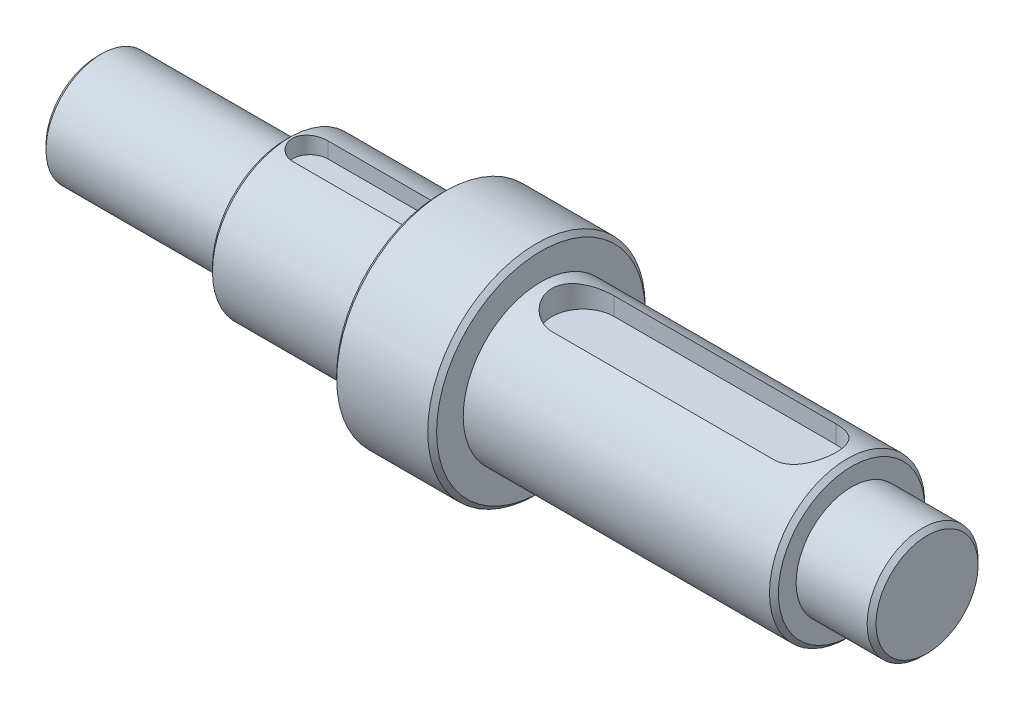
ISO-10303-21;
HEADER;
FILE_DESCRIPTION(('STEP AP214'),'2;1');
FILE_NAME('part.step','',(''),(''),'','','');
FILE_SCHEMA(('AUTOMOTIVE_DESIGN { 1 0 10303 214 1 1 1 1 }'));
ENDSEC;
DATA;
#1=APPLICATION_CONTEXT('core data for automotive mechanical design processes');
#2=APPLICATION_PROTOCOL_DEFINITION('international standard','automotive_design',2000,#1);
#3=PRODUCT_CONTEXT('',#1,'mechanical');
#4=PRODUCT('Part','Part','',(#3));
#5=PRODUCT_RELATED_PRODUCT_CATEGORY('part','',(#4));
#6=PRODUCT_DEFINITION_FORMATION('','',#4);
#7=PRODUCT_DEFINITION_CONTEXT('part definition',#1,'design');
#8=PRODUCT_DEFINITION('design','',#6,#7);
#9=PRODUCT_DEFINITION_SHAPE('','',#8);
#10=(LENGTH_UNIT() NAMED_UNIT(*) SI_UNIT(.MILLI.,.METRE.));
#11=(NAMED_UNIT(*) PLANE_ANGLE_UNIT() SI_UNIT($,.RADIAN.));
#12=(NAMED_UNIT(*) SI_UNIT($,.STERADIAN.) SOLID_ANGLE_UNIT());
#13=UNCERTAINTY_MEASURE_WITH_UNIT(LENGTH_MEASURE(1.E-05),#10,'distance_accuracy_value','');
#14=(GEOMETRIC_REPRESENTATION_CONTEXT(3) GLOBAL_UNCERTAINTY_ASSIGNED_CONTEXT((#13)) GLOBAL_UNIT_ASSIGNED_CONTEXT((#10,
#11,#12)) REPRESENTATION_CONTEXT('',''));
#15=CARTESIAN_POINT('',(0.,0.,0.));
#16=DIRECTION('',(0.,0.,1.));
#17=DIRECTION('',(1.,0.,0.));
#18=AXIS2_PLACEMENT_3D('',#15,#16,#17);
#19=CARTESIAN_POINT('',(-68.9095127610209,0.,0.));
#20=DIRECTION('',(1.,0.,0.));
#21=DIRECTION('',(0.,0.,-1.));
#22=AXIS2_PLACEMENT_3D('',#19,#20,#21);
#23=PLANE('',#22);
#24=CARTESIAN_POINT('',(-68.9095127610209,0.,0.));
#25=DIRECTION('',(-1.,0.,0.));
#26=DIRECTION('',(0.,0.,1.));
#27=AXIS2_PLACEMENT_3D('',#24,#25,#26);
#28=CIRCLE('',#27,11.5);
#29=CARTESIAN_POINT('',(-68.9095127610209,0.,11.5));
#30=VERTEX_POINT('',#29);
#31=EDGE_CURVE('E196',#30,#30,#28,.T.);
#32=ORIENTED_EDGE('',*,*,#31,.T.);
#33=EDGE_LOOP('',(#32));
#34=FACE_BOUND('',#33,.T.);
#35=ADVANCED_FACE('F33',(#34),#23,.F.);
#36=CARTESIAN_POINT('',(-67.9095127610209,0.,0.));
#37=DIRECTION('',(1.,0.,0.));
#38=DIRECTION('',(0.,0.,-1.));
#39=AXIS2_PLACEMENT_3D('',#36,#37,#38);
#40=CONICAL_SURFACE('',#39,12.5,0.785398163397448);
#41=ORIENTED_EDGE('',*,*,#31,.F.);
#42=EDGE_LOOP('',(#41));
#43=FACE_BOUND('',#42,.T.);
#44=CARTESIAN_POINT('',(-67.9095127610209,0.,0.));
#45=DIRECTION('',(-1.,0.,0.));
#46=DIRECTION('',(0.,0.,1.));
#47=AXIS2_PLACEMENT_3D('',#44,#45,#46);
#48=CIRCLE('',#47,12.5);
#49=CARTESIAN_POINT('',(-67.9095127610209,0.,12.5));
#50=VERTEX_POINT('',#49);
#51=EDGE_CURVE('E193',#50,#50,#48,.T.);
#52=ORIENTED_EDGE('',*,*,#51,.T.);
#53=EDGE_LOOP('',(#52));
#54=FACE_BOUND('',#53,.T.);
#55=ADVANCED_FACE('F285',(#43,#54),#40,.T.);
#56=CARTESIAN_POINT('',(-92.2273781902552,0.,0.));
#57=DIRECTION('',(-1.,0.,0.));
#58=DIRECTION('',(0.,0.,1.));
#59=AXIS2_PLACEMENT_3D('',#56,#57,#58);
#60=CYLINDRICAL_SURFACE('',#59,12.5);
#61=ORIENTED_EDGE('',*,*,#51,.F.);
#62=EDGE_LOOP('',(#61));
#63=FACE_BOUND('',#62,.T.);
#64=CARTESIAN_POINT('',(-26.4095127610209,0.,0.));
#65=DIRECTION('',(-1.,0.,0.));
#66=DIRECTION('',(0.,0.,1.));
#67=AXIS2_PLACEMENT_3D('',#64,#65,#66);
#68=CIRCLE('',#67,12.5);
#69=CARTESIAN_POINT('',(-26.4095127610209,0.,12.5));
#70=VERTEX_POINT('',#69);
#71=EDGE_CURVE('E190',#70,#70,#68,.T.);
#72=ORIENTED_EDGE('',*,*,#71,.T.);
#73=EDGE_LOOP('',(#72));
#74=FACE_BOUND('',#73,.T.);
#75=ADVANCED_FACE('F290',(#63,#74),#60,.T.);
#76=CARTESIAN_POINT('',(-26.4095127610209,12.5,0.));
#77=DIRECTION('',(1.,0.,0.));
#78=DIRECTION('',(0.,0.,-1.));
#79=AXIS2_PLACEMENT_3D('',#76,#77,#78);
#80=PLANE('',#79);
#81=ORIENTED_EDGE('',*,*,#71,.F.);
#82=EDGE_LOOP('',(#81));
#83=FACE_BOUND('',#82,.T.);
#84=CARTESIAN_POINT('',(-26.4095127610209,0.,0.));
#85=DIRECTION('',(-1.,0.,0.));
#86=DIRECTION('',(0.,0.,1.));
#87=AXIS2_PLACEMENT_3D('',#84,#85,#86);
#88=CIRCLE('',#87,16.5);
#89=CARTESIAN_POINT('',(-26.4095127610209,0.,16.5));
#90=VERTEX_POINT('',#89);
#91=EDGE_CURVE('E187',#90,#90,#88,.T.);
#92=ORIENTED_EDGE('',*,*,#91,.T.);
#93=EDGE_LOOP('',(#92));
#94=FACE_BOUND('',#93,.T.);
#95=ADVANCED_FACE('F298',(#83,#94),#80,.F.);
#96=CARTESIAN_POINT('',(-25.4095127610209,0.,0.));
#97=DIRECTION('',(1.,0.,0.));
#98=DIRECTION('',(0.,0.,-1.));
#99=AXIS2_PLACEMENT_3D('',#96,#97,#98);
#100=CONICAL_SURFACE('',#99,17.5,0.785398163397448);
#101=ORIENTED_EDGE('',*,*,#91,.F.);
#102=EDGE_LOOP('',(#101));
#103=FACE_BOUND('',#102,.T.);
#104=CARTESIAN_POINT('',(-25.4095127610209,0.,0.));
#105=DIRECTION('',(-1.,0.,0.));
#106=DIRECTION('',(0.,0.,1.));
#107=AXIS2_PLACEMENT_3D('',#104,#105,#106);
#108=CIRCLE('',#107,17.5);
#109=CARTESIAN_POINT('',(-25.4095127610209,0.,17.5));
#110=VERTEX_POINT('',#109);
#111=EDGE_CURVE('E184',#110,#110,#108,.T.);
#112=ORIENTED_EDGE('',*,*,#111,.T.);
#113=EDGE_LOOP('',(#112));
#114=FACE_BOUND('',#113,.T.);
#115=ADVANCED_FACE('F304',(#103,#114),#100,.T.);
#116=CARTESIAN_POINT('',(-92.2273781902552,0.,0.));
#117=DIRECTION('',(-1.,0.,0.));
#118=DIRECTION('',(0.,0.,1.));
#119=AXIS2_PLACEMENT_3D('',#116,#117,#118);
#120=CYLINDRICAL_SURFACE('',#119,17.5);
#121=DIRECTION('',(-1.,0.,0.));
#122=VECTOR('',#121,1.);
#123=CARTESIAN_POINT('',(-92.2273781902552,17.0367250374008,-4.));
#124=LINE('',#123,#122);
#125=CARTESIAN_POINT('',(-20.9095127610209,17.0367250374008,-4.));
#126=VERTEX_POINT('',#125);
#127=CARTESIAN_POINT('',(4.09048723897912,17.0367250374008,-4.));
#128=VERTEX_POINT('',#127);
#129=EDGE_CURVE('E449',#126,#128,#124,.F.);
#130=ORIENTED_EDGE('',*,*,#129,.T.);
#131=CARTESIAN_POINT('',(4.09048723897912,17.0367250374008,-4.));
#132=CARTESIAN_POINT('',(4.20141908799889,17.0367138660067,-4.00001248231752));
#133=CARTESIAN_POINT('',(4.31234376193843,17.0378082617858,-3.99538546502867));
#134=CARTESIAN_POINT('',(4.53336980621734,17.0421253952987,-3.97694932157873));
#135=CARTESIAN_POINT('',(4.64347129579083,17.0453478185126,-3.96314155232038));
#136=CARTESIAN_POINT('',(4.86188200385341,17.0538307536469,-3.92647318924765));
#137=CARTESIAN_POINT('',(4.97019404718199,17.059087651771,-3.90362864568808));
#138=CARTESIAN_POINT('',(5.18442812254881,17.0714746819689,-3.8490944107021));
#139=CARTESIAN_POINT('',(5.29035013236459,17.0786048314525,-3.81740463706964));
#140=CARTESIAN_POINT('',(5.60342224091412,17.1025105269156,-3.70940007909276));
#141=CARTESIAN_POINT('',(5.80607652477758,17.1218095761762,-3.6201165136919));
#142=CARTESIAN_POINT('',(6.19346842433704,17.1649441397841,-3.40971418070428));
#143=CARTESIAN_POINT('',(6.37820256297584,17.1887805318677,-3.28858925176468));
#144=CARTESIAN_POINT('',(6.72799335995641,17.2387926899631,-3.01555269417646));
#145=CARTESIAN_POINT('',(6.89267670461687,17.2650004661165,-2.8631677865296));
#146=CARTESIAN_POINT('',(7.19438675515377,17.3165247611238,-2.53295238865313));
#147=CARTESIAN_POINT('',(7.33140911024808,17.3418411392541,-2.35511790297881));
#148=CARTESIAN_POINT('',(7.57540755901788,17.3890809668325,-1.97651609742511));
#149=CARTESIAN_POINT('',(7.68201916164438,17.410961949179,-1.77550809318057));
#150=CARTESIAN_POINT('',(7.85980015675486,17.4484992744045,-1.35785483515843));
#151=CARTESIAN_POINT('',(7.93097573008189,17.4641567027157,-1.14121231594595));
#152=CARTESIAN_POINT('',(8.03468222489924,17.4872566687127,-0.702348968435727));
#153=CARTESIAN_POINT('',(8.06785115082917,17.4948346770719,-0.480286158684643));
#154=CARTESIAN_POINT('',(8.09659989733755,17.5013922359856,-0.0336222528298661));
#155=CARTESIAN_POINT('',(8.09218354586803,17.5003726621791,0.190978582456414));
#156=CARTESIAN_POINT('',(8.04635618896706,17.489952340558,0.631926010215037));
#157=CARTESIAN_POINT('',(8.00563403409762,17.4807076590668,0.848348430712727));
#158=CARTESIAN_POINT('',(7.88945127387399,17.4550549045918,1.27120201757733));
#159=CARTESIAN_POINT('',(7.81398929226324,17.4386465478123,1.4776327877559));
#160=CARTESIAN_POINT('',(7.62987695849114,17.4002626903077,1.87652973429281));
#161=CARTESIAN_POINT('',(7.52096987904288,17.3782443578209,2.06887311134545));
#162=CARTESIAN_POINT('',(7.27324422696532,17.3310474587669,2.43280009121924));
#163=CARTESIAN_POINT('',(7.13442204947528,17.3058685114888,2.60438118822771));
#164=CARTESIAN_POINT('',(6.82712910413045,17.2544419046369,2.92598580900956));
#165=CARTESIAN_POINT('',(6.658059501403,17.2281829516239,3.07543489417491));
#166=CARTESIAN_POINT('',(6.29682193596832,17.1780692090276,3.34405202485233));
#167=CARTESIAN_POINT('',(6.10464768133959,17.1542150775981,3.46321179425783));
#168=CARTESIAN_POINT('',(5.80286539782332,17.1222689727167,3.61671597326183));
#169=CARTESIAN_POINT('',(5.69973691447776,17.1122387789592,3.66376574815988));
#170=CARTESIAN_POINT('',(5.48974903880957,17.0937715302981,3.7489839926838));
#171=CARTESIAN_POINT('',(5.38289114055105,17.0853338458964,3.78715597297674));
#172=CARTESIAN_POINT('',(5.16631984756072,17.0703178704533,3.85427424858371));
#173=CARTESIAN_POINT('',(5.05660954038246,17.0637376534167,3.88323010403838));
#174=CARTESIAN_POINT('',(4.83506821183043,17.0526294698307,3.9317231468982));
#175=CARTESIAN_POINT('',(4.72323821646553,17.0481005355421,3.95126477595514));
#176=CARTESIAN_POINT('',(4.52449016412548,17.0420340571271,3.97733749089981));
#177=CARTESIAN_POINT('',(4.43783880166462,17.0400453891908,3.98583914323426));
#178=CARTESIAN_POINT('',(4.2642899419509,17.0373899876292,3.99716769798062));
#179=CARTESIAN_POINT('',(4.1773930889422,17.0367210727584,4.00000396405785));
#180=CARTESIAN_POINT('',(4.09048723897912,17.0367250374008,4.));
#181=B_SPLINE_CURVE_WITH_KNOTS('',3,(#131,#132,#133,#134,#135,#136,#137,#138,#139,#140,#141,
#142,#143,#144,#145,#146,#147,#148,#149,#150,#151,#152,#153,#154,#155,#156,#157,#158,#159,#160,
#161,#162,#163,#164,#165,#166,#167,#168,#169,#170,#171,#172,#173,#174,#175,#176,#177,#178,#179,
#180),.UNSPECIFIED.,.F.,.F.,(4,2,2,2,2,2,2,2,2,2,2,2,2,2,2,2,2,2,2,2,2,2,2,2,4),(0.,
0.332681247866697,0.665313336820848,0.997357270100382,1.32940428944207,1.99290262989595,
2.65652945292504,3.33106339250549,4.00570334664101,4.68811868485082,5.37041495269124,
6.0410817607265,6.71168026410032,7.36981967360707,8.02798515827642,8.69133469760162,
9.35476421731793,10.0331782060872,10.7117773626502,11.0528239514451,11.3937354453644,
11.7342921410368,12.0746880036043,12.3357711604052,12.5964224446493),.UNSPECIFIED.);
#182=CARTESIAN_POINT('',(4.09048723897912,17.0367250374008,4.));
#183=VERTEX_POINT('',#182);
#184=EDGE_CURVE('E199',#128,#183,#181,.T.);
#185=ORIENTED_EDGE('',*,*,#184,.T.);
#186=DIRECTION('',(-1.,0.,0.));
#187=VECTOR('',#186,1.);
#188=CARTESIAN_POINT('',(-92.2273781902552,17.0367250374008,4.));
#189=LINE('',#188,#187);
#190=CARTESIAN_POINT('',(-20.9095127610209,17.0367250374008,4.));
#191=VERTEX_POINT('',#190);
#192=EDGE_CURVE('E451',#183,#191,#189,.T.);
#193=ORIENTED_EDGE('',*,*,#192,.T.);
#194=CARTESIAN_POINT('',(-20.9095127610209,17.0367250374008,4.));
#195=CARTESIAN_POINT('',(-21.0204446100406,17.0367138660067,4.00001248231752));
#196=CARTESIAN_POINT('',(-21.1313692839802,17.0378082617858,3.99538546502867));
#197=CARTESIAN_POINT('',(-21.3523953282591,17.0421253952987,3.97694932157873));
#198=CARTESIAN_POINT('',(-21.4624968178326,17.0453478185126,3.96314155232038));
#199=CARTESIAN_POINT('',(-21.6809075258952,17.0538307536469,3.92647318924765));
#200=CARTESIAN_POINT('',(-21.7892195692238,17.059087651771,3.90362864568808));
#201=CARTESIAN_POINT('',(-22.0034536445906,17.0714746819689,3.8490944107021));
#202=CARTESIAN_POINT('',(-22.1093756544064,17.0786048314525,3.81740463706964));
#203=CARTESIAN_POINT('',(-22.4224477629559,17.1025105269156,3.70940007909276));
#204=CARTESIAN_POINT('',(-22.6251020468193,17.1218095761762,3.6201165136919));
#205=CARTESIAN_POINT('',(-23.0124939463788,17.1649441397841,3.40971418070428));
#206=CARTESIAN_POINT('',(-23.1972280850176,17.1887805318677,3.28858925176468));
#207=CARTESIAN_POINT('',(-23.5470188819982,17.2387926899631,3.01555269417646));
#208=CARTESIAN_POINT('',(-23.7117022266586,17.2650004661165,2.8631677865296));
#209=CARTESIAN_POINT('',(-24.0134122771955,17.3165247611238,2.53295238865314));
#210=CARTESIAN_POINT('',(-24.1504346322898,17.3418411392541,2.35511790297881));
#211=CARTESIAN_POINT('',(-24.3944330810596,17.3890809668325,1.97651609742511));
#212=CARTESIAN_POINT('',(-24.5010446836861,17.410961949179,1.77550809318057));
#213=CARTESIAN_POINT('',(-24.6788256787966,17.4484992744045,1.35785483515843));
#214=CARTESIAN_POINT('',(-24.7500012521237,17.4641567027157,1.14121231594595));
#215=CARTESIAN_POINT('',(-24.853707746941,17.4872566687127,0.702348968435727));
#216=CARTESIAN_POINT('',(-24.8868766728709,17.4948346770719,0.480286158684643));
#217=CARTESIAN_POINT('',(-24.9156254193793,17.5013922359856,0.033622252829867));
#218=CARTESIAN_POINT('',(-24.9112090679098,17.5003726621791,-0.190978582456414));
#219=CARTESIAN_POINT('',(-24.8653817110088,17.489952340558,-0.631926010215036));
#220=CARTESIAN_POINT('',(-24.8246595561394,17.4807076590668,-0.848348430712726));
#221=CARTESIAN_POINT('',(-24.7084767959158,17.4550549045918,-1.27120201757733));
#222=CARTESIAN_POINT('',(-24.633014814305,17.4386465478123,-1.4776327877559));
#223=CARTESIAN_POINT('',(-24.4489024805329,17.4002626903077,-1.87652973429281));
#224=CARTESIAN_POINT('',(-24.3399954010846,17.3782443578209,-2.06887311134545));
#225=CARTESIAN_POINT('',(-24.0922697490071,17.3310474587669,-2.43280009121923));
#226=CARTESIAN_POINT('',(-23.953447571517,17.3058685114888,-2.60438118822771));
#227=CARTESIAN_POINT('',(-23.6461546261722,17.2544419046369,-2.92598580900956));
#228=CARTESIAN_POINT('',(-23.4770850234448,17.2281829516239,-3.07543489417491));
#229=CARTESIAN_POINT('',(-23.1158474580101,17.1780692090276,-3.34405202485233));
#230=CARTESIAN_POINT('',(-22.9236732033814,17.1542150775981,-3.46321179425783));
#231=CARTESIAN_POINT('',(-22.6218909198651,17.1222689727167,-3.61671597326183));
#232=CARTESIAN_POINT('',(-22.5187624365195,17.1122387789592,-3.66376574815988));
#233=CARTESIAN_POINT('',(-22.3087745608513,17.0937715302981,-3.7489839926838));
#234=CARTESIAN_POINT('',(-22.2019166625928,17.0853338458964,-3.78715597297674));
#235=CARTESIAN_POINT('',(-21.9853453696025,17.0703178704533,-3.85427424858371));
#236=CARTESIAN_POINT('',(-21.8756350624242,17.0637376534167,-3.88323010403838));
#237=CARTESIAN_POINT('',(-21.6540937338722,17.0526294698307,-3.9317231468982));
#238=CARTESIAN_POINT('',(-21.5422637385073,17.0481005355421,-3.95126477595514));
#239=CARTESIAN_POINT('',(-21.3435156861672,17.0420340571271,-3.97733749089981));
#240=CARTESIAN_POINT('',(-21.2568643237064,17.0400453891908,-3.98583914323426));
#241=CARTESIAN_POINT('',(-21.0833154639927,17.0373899876292,-3.99716769798062));
#242=CARTESIAN_POINT('',(-20.996418610984,17.0367210727584,-4.00000396405785));
#243=CARTESIAN_POINT('',(-20.9095127610209,17.0367250374008,-4.));
#244=B_SPLINE_CURVE_WITH_KNOTS('',3,(#194,#195,#196,#197,#198,#199,#200,#201,#202,#203,#204,
#205,#206,#207,#208,#209,#210,#211,#212,#213,#214,#215,#216,#217,#218,#219,#220,#221,#222,#223,
#224,#225,#226,#227,#228,#229,#230,#231,#232,#233,#234,#235,#236,#237,#238,#239,#240,#241,#242,
#243),.UNSPECIFIED.,.F.,.F.,(4,2,2,2,2,2,2,2,2,2,2,2,2,2,2,2,2,2,2,2,2,2,2,2,4),(0.,
0.332681247866697,0.665313336820848,0.997357270100381,1.32940428944207,1.99290262989595,
2.65652945292504,3.33106339250548,4.00570334664101,4.68811868485082,5.37041495269124,
6.0410817607265,6.71168026410032,7.36981967360707,8.02798515827642,8.69133469760162,
9.35476421731793,10.0331782060872,10.7117773626502,11.0528239514451,11.3937354453644,
11.7342921410368,12.0746880036043,12.3357711604052,12.5964224446493),.UNSPECIFIED.);
#245=EDGE_CURVE('E55',#191,#126,#244,.T.);
#246=ORIENTED_EDGE('',*,*,#245,.T.);
#247=EDGE_LOOP('',(#130,#185,#193,#246));
#248=FACE_BOUND('',#247,.T.);
#249=ORIENTED_EDGE('',*,*,#111,.F.);
#250=EDGE_LOOP('',(#249));
#251=FACE_BOUND('',#250,.T.);
#252=CARTESIAN_POINT('',(8.59048723897912,0.,0.));
#253=DIRECTION('',(-1.,0.,0.));
#254=DIRECTION('',(0.,0.,1.));
#255=AXIS2_PLACEMENT_3D('',#252,#253,#254);
#256=CIRCLE('',#255,17.5);
#257=CARTESIAN_POINT('',(8.59048723897912,0.,17.5));
#258=VERTEX_POINT('',#257);
#259=EDGE_CURVE('E181',#258,#258,#256,.T.);
#260=ORIENTED_EDGE('',*,*,#259,.T.);
#261=EDGE_LOOP('',(#260));
#262=FACE_BOUND('',#261,.T.);
#263=ADVANCED_FACE('F214',(#248,#251,#262),#120,.T.);
#264=CARTESIAN_POINT('',(8.59048723897912,17.5,0.));
#265=DIRECTION('',(1.,0.,0.));
#266=DIRECTION('',(0.,0.,-1.));
#267=AXIS2_PLACEMENT_3D('',#264,#265,#266);
#268=PLANE('',#267);
#269=ORIENTED_EDGE('',*,*,#259,.F.);
#270=EDGE_LOOP('',(#269));
#271=FACE_BOUND('',#270,.T.);
#272=CARTESIAN_POINT('',(8.59048723897912,0.,0.));
#273=DIRECTION('',(-1.,0.,0.));
#274=DIRECTION('',(0.,0.,1.));
#275=AXIS2_PLACEMENT_3D('',#272,#273,#274);
#276=CIRCLE('',#275,23.5);
#277=CARTESIAN_POINT('',(8.59048723897912,0.,23.5));
#278=VERTEX_POINT('',#277);
#279=EDGE_CURVE('E178',#278,#278,#276,.T.);
#280=ORIENTED_EDGE('',*,*,#279,.T.);
#281=EDGE_LOOP('',(#280));
#282=FACE_BOUND('',#281,.T.);
#283=ADVANCED_FACE('F314',(#271,#282),#268,.F.);
#284=CARTESIAN_POINT('',(9.59048723897912,0.,0.));
#285=DIRECTION('',(1.,0.,0.));
#286=DIRECTION('',(0.,0.,-1.));
#287=AXIS2_PLACEMENT_3D('',#284,#285,#286);
#288=CONICAL_SURFACE('',#287,24.5,0.785398163397448);
#289=ORIENTED_EDGE('',*,*,#279,.F.);
#290=EDGE_LOOP('',(#289));
#291=FACE_BOUND('',#290,.T.);
#292=CARTESIAN_POINT('',(9.59048723897912,0.,0.));
#293=DIRECTION('',(-1.,0.,0.));
#294=DIRECTION('',(0.,0.,1.));
#295=AXIS2_PLACEMENT_3D('',#292,#293,#294);
#296=CIRCLE('',#295,24.5);
#297=CARTESIAN_POINT('',(9.59048723897912,0.,24.5));
#298=VERTEX_POINT('',#297);
#299=EDGE_CURVE('E175',#298,#298,#296,.T.);
#300=ORIENTED_EDGE('',*,*,#299,.T.);
#301=EDGE_LOOP('',(#300));
#302=FACE_BOUND('',#301,.T.);
#303=ADVANCED_FACE('F320',(#291,#302),#288,.T.);
#304=CARTESIAN_POINT('',(-92.2273781902552,0.,0.));
#305=DIRECTION('',(-1.,0.,0.));
#306=DIRECTION('',(0.,0.,1.));
#307=AXIS2_PLACEMENT_3D('',#304,#305,#306);
#308=CYLINDRICAL_SURFACE('',#307,24.5);
#309=ORIENTED_EDGE('',*,*,#299,.F.);
#310=EDGE_LOOP('',(#309));
#311=FACE_BOUND('',#310,.T.);
#312=CARTESIAN_POINT('',(30.0904872389791,0.,0.));
#313=DIRECTION('',(-1.,0.,0.));
#314=DIRECTION('',(0.,0.,1.));
#315=AXIS2_PLACEMENT_3D('',#312,#313,#314);
#316=CIRCLE('',#315,24.5);
#317=CARTESIAN_POINT('',(30.0904872389791,0.,24.5));
#318=VERTEX_POINT('',#317);
#319=EDGE_CURVE('E172',#318,#318,#316,.T.);
#320=ORIENTED_EDGE('',*,*,#319,.T.);
#321=EDGE_LOOP('',(#320));
#322=FACE_BOUND('',#321,.T.);
#323=ADVANCED_FACE('F325',(#311,#322),#308,.T.);
#324=CARTESIAN_POINT('',(31.0904872389791,0.,0.));
#325=DIRECTION('',(-1.,0.,0.));
#326=DIRECTION('',(0.,0.,1.));
#327=AXIS2_PLACEMENT_3D('',#324,#325,#326);
#328=CONICAL_SURFACE('',#327,23.5,0.785398163397448);
#329=ORIENTED_EDGE('',*,*,#319,.F.);
#330=EDGE_LOOP('',(#329));
#331=FACE_BOUND('',#330,.T.);
#332=CARTESIAN_POINT('',(31.0904872389791,0.,0.));
#333=DIRECTION('',(-1.,0.,0.));
#334=DIRECTION('',(0.,0.,1.));
#335=AXIS2_PLACEMENT_3D('',#332,#333,#334);
#336=CIRCLE('',#335,23.5);
#337=CARTESIAN_POINT('',(31.0904872389791,0.,23.5));
#338=VERTEX_POINT('',#337);
#339=EDGE_CURVE('E169',#338,#338,#336,.T.);
#340=ORIENTED_EDGE('',*,*,#339,.T.);
#341=EDGE_LOOP('',(#340));
#342=FACE_BOUND('',#341,.T.);
#343=ADVANCED_FACE('F331',(#331,#342),#328,.T.);
#344=CARTESIAN_POINT('',(31.0904872389791,23.5,0.));
#345=DIRECTION('',(-1.,0.,0.));
#346=DIRECTION('',(0.,0.,1.));
#347=AXIS2_PLACEMENT_3D('',#344,#345,#346);
#348=PLANE('',#347);
#349=ORIENTED_EDGE('',*,*,#339,.F.);
#350=EDGE_LOOP('',(#349));
#351=FACE_BOUND('',#350,.T.);
#352=CARTESIAN_POINT('',(31.0904872389791,0.,0.));
#353=DIRECTION('',(-1.,0.,0.));
#354=DIRECTION('',(0.,0.,1.));
#355=AXIS2_PLACEMENT_3D('',#352,#353,#354);
#356=CIRCLE('',#355,17.5);
#357=CARTESIAN_POINT('',(31.0904872389791,0.,17.5));
#358=VERTEX_POINT('',#357);
#359=EDGE_CURVE('E166',#358,#358,#356,.T.);
#360=ORIENTED_EDGE('',*,*,#359,.T.);
#361=EDGE_LOOP('',(#360));
#362=FACE_BOUND('',#361,.T.);
#363=ADVANCED_FACE('F258',(#351,#362),#348,.F.);
#364=CARTESIAN_POINT('',(-92.2273781902552,0.,0.));
#365=DIRECTION('',(-1.,0.,0.));
#366=DIRECTION('',(0.,0.,1.));
#367=AXIS2_PLACEMENT_3D('',#364,#365,#366);
#368=CYLINDRICAL_SURFACE('',#367,17.5);
#369=DIRECTION('',(-1.,0.,0.));
#370=VECTOR('',#369,1.);
#371=CARTESIAN_POINT('',(-92.2273781902552,16.0390149323454,-7.));
#372=LINE('',#371,#370);
#373=CARTESIAN_POINT('',(40.5904872389791,16.0390149323454,-7.));
#374=VERTEX_POINT('',#373);
#375=CARTESIAN_POINT('',(90.5904872389791,16.0390149323454,-7.));
#376=VERTEX_POINT('',#375);
#377=EDGE_CURVE('E11',#374,#376,#372,.F.);
#378=ORIENTED_EDGE('',*,*,#377,.T.);
#379=CARTESIAN_POINT('',(90.5904872389791,16.0390149323454,-7.));
#380=CARTESIAN_POINT('',(90.7788044456278,16.0389752733968,-7.00002977048744));
#381=CARTESIAN_POINT('',(90.9671054302353,16.0423302199083,-6.99240211723627));
#382=CARTESIAN_POINT('',(91.3421884205848,16.0555373781509,-6.96205578997394));
#383=CARTESIAN_POINT('',(91.528970977435,16.065387115302,-6.93934286357865));
#384=CARTESIAN_POINT('',(91.8989478525811,16.0912414264678,-6.87916795928254));
#385=CARTESIAN_POINT('',(92.0821533862435,16.1072216644699,-6.84176428487683));
#386=CARTESIAN_POINT('',(92.4444513375648,16.1448052762358,-6.75260066012111));
#387=CARTESIAN_POINT('',(92.62354350343,16.1664089932395,-6.70083983344195));
#388=CARTESIAN_POINT('',(92.9761959060988,16.2145342219444,-6.58353130438258));
#389=CARTESIAN_POINT('',(93.1497631751999,16.2410491630023,-6.51800200704895));
#390=CARTESIAN_POINT('',(93.4906372048829,16.2982398762079,-6.37364912170456));
#391=CARTESIAN_POINT('',(93.6579415908299,16.3289172065821,-6.2948205522932));
#392=CARTESIAN_POINT('',(93.9853810254402,16.3935818337901,-6.1244409615934));
#393=CARTESIAN_POINT('',(94.1455122681795,16.4275708580751,-6.03288328978561));
#394=CARTESIAN_POINT('',(94.4577359047685,16.4979533867701,-5.83766232543686));
#395=CARTESIAN_POINT('',(94.609825347452,16.5343477630188,-5.73399463295906));
#396=CARTESIAN_POINT('',(94.9127064101489,16.6105089133048,-5.50960400925462));
#397=CARTESIAN_POINT('',(95.063033458316,16.6503529603704,-5.3882798261924));
#398=CARTESIAN_POINT('',(95.3530744384824,16.7305950379342,-5.13371194040593));
#399=CARTESIAN_POINT('',(95.4927880676909,16.7709930841987,-5.00046789785534));
#400=CARTESIAN_POINT('',(95.7608578132901,16.8513017391641,-4.72276668795319));
#401=CARTESIAN_POINT('',(95.889209660331,16.8912121598178,-4.57830534349688));
#402=CARTESIAN_POINT('',(96.1336729502122,16.9694873597756,-4.27906605262243));
#403=CARTESIAN_POINT('',(96.249788608944,17.0078526686037,-4.12429168968039));
#404=CARTESIAN_POINT('',(96.4734500415148,17.0835515982152,-3.79885146321944));
#405=CARTESIAN_POINT('',(96.5804669778214,17.1207825079476,-3.62779752817488));
#406=CARTESIAN_POINT('',(96.7795848268386,17.1914591053842,-3.2765543948891));
#407=CARTESIAN_POINT('',(96.8716914010934,17.2249062283526,-3.09636869831209));
#408=CARTESIAN_POINT('',(97.0402044359055,17.2870679069983,-2.72803181638415));
#409=CARTESIAN_POINT('',(97.1166127900608,17.31578303339,-2.53988159506012));
#410=CARTESIAN_POINT('',(97.2529786200482,17.367636875606,-2.15696664795563));
#411=CARTESIAN_POINT('',(97.3129371480993,17.390775948093,-1.96220234614316));
#412=CARTESIAN_POINT('',(97.4132650915438,17.4298097688794,-1.57713403238594));
#413=CARTESIAN_POINT('',(97.4544420980453,17.4460009140269,-1.38707032109769));
#414=CARTESIAN_POINT('',(97.5208754698575,17.4722450511387,-1.00376608434129));
#415=CARTESIAN_POINT('',(97.5461327763272,17.4822984059628,-0.810525747365689));
#416=CARTESIAN_POINT('',(97.5804429866635,17.4959776408713,-0.422440108875656));
#417=CARTESIAN_POINT('',(97.589500498958,17.4996053488854,-0.227595279648425));
#418=CARTESIAN_POINT('',(97.5913211488956,17.5003335193545,0.162179533610087));
#419=CARTESIAN_POINT('',(97.5840848592335,17.4974342112213,0.357109514407691));
#420=CARTESIAN_POINT('',(97.5542704657181,17.4855399164815,0.734513118138501));
#421=CARTESIAN_POINT('',(97.5325811300752,17.4768981361587,0.917068936855519));
#422=CARTESIAN_POINT('',(97.4749799483455,17.4540980852493,1.27963381561551));
#423=CARTESIAN_POINT('',(97.4390634629031,17.4399380152185,1.45964202505281));
#424=CARTESIAN_POINT('',(97.3533658755707,17.4064635698492,1.81576582506985));
#425=CARTESIAN_POINT('',(97.3035895233871,17.3871509603546,1.99188272690389));
#426=CARTESIAN_POINT('',(97.1905929523159,17.3438367479227,2.33922484681341));
#427=CARTESIAN_POINT('',(97.1273676269891,17.319833364228,2.51044817875929));
#428=CARTESIAN_POINT('',(96.9869858374562,17.2673360941629,2.8493759943152));
#429=CARTESIAN_POINT('',(96.9096385238228,17.2387814708111,3.01699194659557));
#430=CARTESIAN_POINT('',(96.7422305443381,17.1781215258452,3.34514512562917));
#431=CARTESIAN_POINT('',(96.6521655546602,17.1460149974419,3.5056799204284));
#432=CARTESIAN_POINT('',(96.4599677046453,17.0790131236981,3.81876204706711));
#433=CARTESIAN_POINT('',(96.3578335509445,17.0441174795983,3.97130852032427));
#434=CARTESIAN_POINT('',(96.1421540849861,16.9723499864897,4.26761987662594));
#435=CARTESIAN_POINT('',(96.0286081717019,16.9354780334418,4.41138429650148));
#436=CARTESIAN_POINT('',(95.7829347551086,16.8581445983064,4.69856406049532));
#437=CARTESIAN_POINT('',(95.6500762207415,16.8176065589445,4.84133411766911));
#438=CARTESIAN_POINT('',(95.3729945728663,16.7363329993899,5.11522854799373));
#439=CARTESIAN_POINT('',(95.2287747841468,16.6955975402215,5.24635630446195));
#440=CARTESIAN_POINT('',(94.9296348737334,16.6149764927148,5.49634622388203));
#441=CARTESIAN_POINT('',(94.774706135124,16.5750916233731,5.61519831288958));
#442=CARTESIAN_POINT('',(94.4551833701638,16.4973294115574,5.83971185211883));
#443=CARTESIAN_POINT('',(94.2905931152817,16.4594512965686,5.94537839975713));
#444=CARTESIAN_POINT('',(93.9476686868559,16.3857200622421,6.14572280070553));
#445=CARTESIAN_POINT('',(93.7690731005583,16.3499588088217,6.23998790860957));
#446=CARTESIAN_POINT('',(93.4037891547123,16.2828884333371,6.41296751186905));
#447=CARTESIAN_POINT('',(93.2171043260204,16.2515773938496,6.49168871021356));
#448=CARTESIAN_POINT('',(92.8370890703008,16.1945049972359,6.63278222994985));
#449=CARTESIAN_POINT('',(92.6437672383632,16.168736754702,6.69517485625373));
#450=CARTESIAN_POINT('',(92.2518192969976,16.1236515550448,6.80303455331392));
#451=CARTESIAN_POINT('',(92.0531956086743,16.1043317058905,6.84850921263796));
#452=CARTESIAN_POINT('',(91.6449481091188,16.0723072315698,6.92334288535216));
#453=CARTESIAN_POINT('',(91.435185149166,16.0598644196122,6.95206612646659));
#454=CARTESIAN_POINT('',(91.1191322747683,16.0473784702879,6.98081208346758));
#455=CARTESIAN_POINT('',(91.0135639640917,16.0442462060019,6.98800424720682));
#456=CARTESIAN_POINT('',(90.8021655755459,16.0400632612632,6.99759856466878));
#457=CARTESIAN_POINT('',(90.6963354896668,16.039012645314,7.00000056995996));
#458=CARTESIAN_POINT('',(90.5904872389791,16.0390149323454,7.));
#459=B_SPLINE_CURVE_WITH_KNOTS('',3,(#379,#380,#381,#382,#383,#384,#385,#386,#387,#388,#389,
#390,#391,#392,#393,#394,#395,#396,#397,#398,#399,#400,#401,#402,#403,#404,#405,#406,#407,#408,
#409,#410,#411,#412,#413,#414,#415,#416,#417,#418,#419,#420,#421,#422,#423,#424,#425,#426,#427,
#428,#429,#430,#431,#432,#433,#434,#435,#436,#437,#438,#439,#440,#441,#442,#443,#444,#445,#446,
#447,#448,#449,#450,#451,#452,#453,#454,#455,#456,#457,#458),.UNSPECIFIED.,.F.,.F.,(4,2,2,2,2,2,
2,2,2,2,2,2,2,2,2,2,2,2,2,2,2,2,2,2,2,2,2,2,2,2,2,2,2,2,2,2,2,2,2,4),(0.,0.564741985882135,
1.12926892366124,1.6915776894512,2.25392078489309,2.8155168952135,3.37732382695849,
3.93942539439666,4.50173182929475,5.0928093500211,5.68390372730163,6.27521928204673,
6.86633043249007,7.48109453721441,8.09562466240333,8.71008061631073,9.32449725715898,
9.90917905170551,10.4938262771254,11.0783071588623,11.6627674975743,12.214247217053,
12.7659069177314,13.3173777995947,13.8690584443287,14.428836185522,14.9888047033781,
15.5488332834667,16.108891374228,16.7057974962847,17.3025295824187,17.8997475455416,
18.496733909321,19.11121416217,19.7254288516392,20.3388760838905,20.9520478211806,
21.5871885149797,21.9046550012937,22.2221313247158),.UNSPECIFIED.);
#460=CARTESIAN_POINT('',(90.5904872389791,16.0390149323454,7.));
#461=VERTEX_POINT('',#460);
#462=EDGE_CURVE('E263',#376,#461,#459,.T.);
#463=ORIENTED_EDGE('',*,*,#462,.T.);
#464=DIRECTION('',(-1.,0.,0.));
#465=VECTOR('',#464,1.);
#466=CARTESIAN_POINT('',(-92.2273781902552,16.0390149323454,7.));
#467=LINE('',#466,#465);
#468=CARTESIAN_POINT('',(40.5904872389791,16.0390149323454,7.));
#469=VERTEX_POINT('',#468);
#470=EDGE_CURVE('E40',#461,#469,#467,.T.);
#471=ORIENTED_EDGE('',*,*,#470,.T.);
#472=CARTESIAN_POINT('',(40.5904872389791,16.0390149323454,7.));
#473=CARTESIAN_POINT('',(40.4021700323304,16.0389752733968,7.00002977048744));
#474=CARTESIAN_POINT('',(40.2138690477229,16.0423302199083,6.99240211723627));
#475=CARTESIAN_POINT('',(39.8387860573734,16.0555373781509,6.96205578997394));
#476=CARTESIAN_POINT('',(39.6520035005233,16.065387115302,6.93934286357865));
#477=CARTESIAN_POINT('',(39.2820266253771,16.0912414264678,6.87916795928254));
#478=CARTESIAN_POINT('',(39.0988210917148,16.1072216644699,6.84176428487683));
#479=CARTESIAN_POINT('',(38.7365231403935,16.1448052762358,6.75260066012111));
#480=CARTESIAN_POINT('',(38.5574309745283,16.1664089932395,6.70083983344195));
#481=CARTESIAN_POINT('',(38.2047785718595,16.2145342219444,6.58353130438258));
#482=CARTESIAN_POINT('',(38.0312113027584,16.2410491630023,6.51800200704895));
#483=CARTESIAN_POINT('',(37.6903372730754,16.2982398762079,6.37364912170456));
#484=CARTESIAN_POINT('',(37.5230328871284,16.3289172065821,6.2948205522932));
#485=CARTESIAN_POINT('',(37.1955934525181,16.3935818337901,6.1244409615934));
#486=CARTESIAN_POINT('',(37.0354622097788,16.4275708580751,6.03288328978561));
#487=CARTESIAN_POINT('',(36.7232385731898,16.4979533867701,5.83766232543686));
#488=CARTESIAN_POINT('',(36.5711491305063,16.5343477630189,5.73399463295905));
#489=CARTESIAN_POINT('',(36.2682680678093,16.6105089133048,5.5096040092546));
#490=CARTESIAN_POINT('',(36.1179410196423,16.6503529603704,5.38827982619238));
#491=CARTESIAN_POINT('',(35.8279000394759,16.7305950379342,5.13371194040592));
#492=CARTESIAN_POINT('',(35.6881864102674,16.7709930841987,5.00046789785534));
#493=CARTESIAN_POINT('',(35.4201166646682,16.8513017391641,4.72276668795318));
#494=CARTESIAN_POINT('',(35.2917648176273,16.8912121598178,4.57830534349687));
#495=CARTESIAN_POINT('',(35.0473015277461,16.9694873597756,4.27906605262243));
#496=CARTESIAN_POINT('',(34.9311858690142,17.0078526686037,4.12429168968039));
#497=CARTESIAN_POINT('',(34.7075244364434,17.0835515982152,3.79885146321944));
#498=CARTESIAN_POINT('',(34.6005075001369,17.1207825079476,3.62779752817488));
#499=CARTESIAN_POINT('',(34.4013896511197,17.1914591053842,3.2765543948891));
#500=CARTESIAN_POINT('',(34.3092830768649,17.2249062283526,3.09636869831208));
#501=CARTESIAN_POINT('',(34.1407700420528,17.2870679069983,2.72803181638415));
#502=CARTESIAN_POINT('',(34.0643616878975,17.31578303339,2.53988159506011));
#503=CARTESIAN_POINT('',(33.9279958579101,17.367636875606,2.15696664795563));
#504=CARTESIAN_POINT('',(33.868037329859,17.390775948093,1.96220234614316));
#505=CARTESIAN_POINT('',(33.7677093864145,17.4298097688794,1.57713403238594));
#506=CARTESIAN_POINT('',(33.726532379913,17.4460009140269,1.38707032109769));
#507=CARTESIAN_POINT('',(33.6600990081007,17.4722450511387,1.00376608434129));
#508=CARTESIAN_POINT('',(33.6348417016311,17.4822984059628,0.810525747365688));
#509=CARTESIAN_POINT('',(33.6005314912948,17.4959776408713,0.422440108875656));
#510=CARTESIAN_POINT('',(33.5914739790003,17.4996053488854,0.227595279648426));
#511=CARTESIAN_POINT('',(33.5896533290627,17.5003335193545,-0.162179533610085));
#512=CARTESIAN_POINT('',(33.5968896187247,17.4974342112213,-0.357109514407689));
#513=CARTESIAN_POINT('',(33.6267040122402,17.4855399164815,-0.734513118138498));
#514=CARTESIAN_POINT('',(33.6483933478831,17.4768981361587,-0.917068936855516));
#515=CARTESIAN_POINT('',(33.7059945296128,17.4540980852493,-1.27963381561551));
#516=CARTESIAN_POINT('',(33.7419110150552,17.4399380152185,-1.4596420250528));
#517=CARTESIAN_POINT('',(33.8276086023876,17.4064635698492,-1.81576582506985));
#518=CARTESIAN_POINT('',(33.8773849545712,17.3871509603546,-1.99188272690389));
#519=CARTESIAN_POINT('',(33.9903815256424,17.3438367479227,-2.3392248468134));
#520=CARTESIAN_POINT('',(34.0536068509692,17.319833364228,-2.51044817875928));
#521=CARTESIAN_POINT('',(34.1939886405021,17.2673360941629,-2.8493759943152));
#522=CARTESIAN_POINT('',(34.2713359541355,17.2387814708111,-3.01699194659556));
#523=CARTESIAN_POINT('',(34.4387439336202,17.1781215258452,-3.34514512562916));
#524=CARTESIAN_POINT('',(34.5288089232981,17.1460149974419,-3.5056799204284));
#525=CARTESIAN_POINT('',(34.721006773313,17.0790131236981,-3.81876204706711));
#526=CARTESIAN_POINT('',(34.8231409270138,17.0441174795983,-3.97130852032427));
#527=CARTESIAN_POINT('',(35.0388203929721,16.9723499864897,-4.26761987662593));
#528=CARTESIAN_POINT('',(35.1523663062564,16.9354780334418,-4.41138429650148));
#529=CARTESIAN_POINT('',(35.3980397228497,16.8581445983064,-4.69856406049532));
#530=CARTESIAN_POINT('',(35.5308982572168,16.8176065589445,-4.84133411766911));
#531=CARTESIAN_POINT('',(35.8079799050919,16.7363329993899,-5.11522854799373));
#532=CARTESIAN_POINT('',(35.9521996938115,16.6955975402215,-5.24635630446194));
#533=CARTESIAN_POINT('',(36.2513396042249,16.6149764927149,-5.49634622388203));
#534=CARTESIAN_POINT('',(36.4062683428342,16.5750916233731,-5.61519831288957));
#535=CARTESIAN_POINT('',(36.7257911077945,16.4973294115574,-5.83971185211883));
#536=CARTESIAN_POINT('',(36.8903813626766,16.4594512965686,-5.94537839975713));
#537=CARTESIAN_POINT('',(37.2333057911024,16.3857200622421,-6.14572280070552));
#538=CARTESIAN_POINT('',(37.4119013773999,16.3499588088217,-6.23998790860955));
#539=CARTESIAN_POINT('',(37.7771853232459,16.2828884333371,-6.41296751186904));
#540=CARTESIAN_POINT('',(37.9638701519378,16.2515773938496,-6.49168871021356));
#541=CARTESIAN_POINT('',(38.3438854076574,16.1945049972359,-6.63278222994985));
#542=CARTESIAN_POINT('',(38.537207239595,16.168736754702,-6.69517485625373));
#543=CARTESIAN_POINT('',(38.9291551809607,16.1236515550448,-6.80303455331392));
#544=CARTESIAN_POINT('',(39.1277788692839,16.1043317058905,-6.84850921263797));
#545=CARTESIAN_POINT('',(39.5360263688394,16.0723072315698,-6.92334288535216));
#546=CARTESIAN_POINT('',(39.7457893287923,16.0598644196122,-6.95206612646659));
#547=CARTESIAN_POINT('',(40.06184220319,16.0473784702879,-6.98081208346758));
#548=CARTESIAN_POINT('',(40.1674105138666,16.0442462060019,-6.98800424720682));
#549=CARTESIAN_POINT('',(40.3788089024124,16.0400632612632,-6.99759856466878));
#550=CARTESIAN_POINT('',(40.4846389882915,16.039012645314,-7.00000056995996));
#551=CARTESIAN_POINT('',(40.5904872389791,16.0390149323454,-7.));
#552=B_SPLINE_CURVE_WITH_KNOTS('',3,(#472,#473,#474,#475,#476,#477,#478,#479,#480,#481,#482,
#483,#484,#485,#486,#487,#488,#489,#490,#491,#492,#493,#494,#495,#496,#497,#498,#499,#500,#501,
#502,#503,#504,#505,#506,#507,#508,#509,#510,#511,#512,#513,#514,#515,#516,#517,#518,#519,#520,
#521,#522,#523,#524,#525,#526,#527,#528,#529,#530,#531,#532,#533,#534,#535,#536,#537,#538,#539,
#540,#541,#542,#543,#544,#545,#546,#547,#548,#549,#550,#551),.UNSPECIFIED.,.F.,.F.,(4,2,2,2,2,2,
2,2,2,2,2,2,2,2,2,2,2,2,2,2,2,2,2,2,2,2,2,2,2,2,2,2,2,2,2,2,2,2,2,4),(0.,0.564741985882149,
1.12926892366125,1.69157768945122,2.25392078489309,2.81551689521351,3.3773238269585,
3.93942539439667,4.50173182929476,5.09280935002112,5.68390372730163,6.27521928204672,
6.86633043249007,7.48109453721442,8.09562466240334,8.71008061631073,9.32449725715899,
9.90917905170551,10.4938262771254,11.0783071588623,11.6627674975743,12.214247217053,
12.7659069177314,13.3173777995947,13.8690584443287,14.428836185522,14.9888047033781,
15.5488332834667,16.108891374228,16.7057974962847,17.3025295824187,17.8997475455416,
18.496733909321,19.11121416217,19.7254288516392,20.3388760838905,20.9520478211806,
21.5871885149797,21.9046550012937,22.2221313247158),.UNSPECIFIED.);
#553=EDGE_CURVE('E47',#469,#374,#552,.T.);
#554=ORIENTED_EDGE('',*,*,#553,.T.);
#555=EDGE_LOOP('',(#378,#463,#471,#554));
#556=FACE_BOUND('',#555,.T.);
#557=ORIENTED_EDGE('',*,*,#359,.F.);
#558=EDGE_LOOP('',(#557));
#559=FACE_BOUND('',#558,.T.);
#560=CARTESIAN_POINT('',(100.090487238979,0.,0.));
#561=DIRECTION('',(-1.,0.,0.));
#562=DIRECTION('',(0.,0.,1.));
#563=AXIS2_PLACEMENT_3D('',#560,#561,#562);
#564=CIRCLE('',#563,17.5);
#565=CARTESIAN_POINT('',(100.090487238979,0.,17.5));
#566=VERTEX_POINT('',#565);
#567=EDGE_CURVE('E163',#566,#566,#564,.T.);
#568=ORIENTED_EDGE('',*,*,#567,.T.);
#569=EDGE_LOOP('',(#568));
#570=FACE_BOUND('',#569,.T.);
#571=ADVANCED_FACE('F253',(#556,#559,#570),#368,.T.);
#572=CARTESIAN_POINT('',(101.090487238979,0.,0.));
#573=DIRECTION('',(-1.,0.,0.));
#574=DIRECTION('',(0.,0.,1.));
#575=AXIS2_PLACEMENT_3D('',#572,#573,#574);
#576=CONICAL_SURFACE('',#575,16.5,0.785398163397448);
#577=ORIENTED_EDGE('',*,*,#567,.F.);
#578=EDGE_LOOP('',(#577));
#579=FACE_BOUND('',#578,.T.);
#580=CARTESIAN_POINT('',(101.090487238979,0.,0.));
#581=DIRECTION('',(-1.,0.,0.));
#582=DIRECTION('',(0.,0.,1.));
#583=AXIS2_PLACEMENT_3D('',#580,#581,#582);
#584=CIRCLE('',#583,16.5);
#585=CARTESIAN_POINT('',(101.090487238979,0.,16.5));
#586=VERTEX_POINT('',#585);
#587=EDGE_CURVE('E160',#586,#586,#584,.T.);
#588=ORIENTED_EDGE('',*,*,#587,.T.);
#589=EDGE_LOOP('',(#588));
#590=FACE_BOUND('',#589,.T.);
#591=ADVANCED_FACE('F249',(#579,#590),#576,.T.);
#592=CARTESIAN_POINT('',(101.090487238979,16.5,0.));
#593=DIRECTION('',(-1.,0.,0.));
#594=DIRECTION('',(0.,0.,1.));
#595=AXIS2_PLACEMENT_3D('',#592,#593,#594);
#596=PLANE('',#595);
#597=ORIENTED_EDGE('',*,*,#587,.F.);
#598=EDGE_LOOP('',(#597));
#599=FACE_BOUND('',#598,.T.);
#600=CARTESIAN_POINT('',(101.090487238979,0.,0.));
#601=DIRECTION('',(-1.,0.,0.));
#602=DIRECTION('',(0.,0.,1.));
#603=AXIS2_PLACEMENT_3D('',#600,#601,#602);
#604=CIRCLE('',#603,12.5);
#605=CARTESIAN_POINT('',(101.090487238979,0.,12.5));
#606=VERTEX_POINT('',#605);
#607=EDGE_CURVE('E157',#606,#606,#604,.T.);
#608=ORIENTED_EDGE('',*,*,#607,.T.);
#609=EDGE_LOOP('',(#608));
#610=FACE_BOUND('',#609,.T.);
#611=ADVANCED_FACE('F245',(#599,#610),#596,.F.);
#612=CARTESIAN_POINT('',(-92.2273781902552,0.,0.));
#613=DIRECTION('',(-1.,0.,0.));
#614=DIRECTION('',(0.,0.,1.));
#615=AXIS2_PLACEMENT_3D('',#612,#613,#614);
#616=CYLINDRICAL_SURFACE('',#615,12.5);
#617=ORIENTED_EDGE('',*,*,#607,.F.);
#618=EDGE_LOOP('',(#617));
#619=FACE_BOUND('',#618,.T.);
#620=CARTESIAN_POINT('',(117.090487238979,0.,0.));
#621=DIRECTION('',(-1.,0.,0.));
#622=DIRECTION('',(0.,0.,1.));
#623=AXIS2_PLACEMENT_3D('',#620,#621,#622);
#624=CIRCLE('',#623,12.5);
#625=CARTESIAN_POINT('',(117.090487238979,0.,12.5));
#626=VERTEX_POINT('',#625);
#627=EDGE_CURVE('E154',#626,#626,#624,.T.);
#628=ORIENTED_EDGE('',*,*,#627,.T.);
#629=EDGE_LOOP('',(#628));
#630=FACE_BOUND('',#629,.T.);
#631=ADVANCED_FACE('F241',(#619,#630),#616,.T.);
#632=CARTESIAN_POINT('',(118.090487238979,0.,0.));
#633=DIRECTION('',(-1.,0.,0.));
#634=DIRECTION('',(0.,0.,1.));
#635=AXIS2_PLACEMENT_3D('',#632,#633,#634);
#636=CONICAL_SURFACE('',#635,11.5,0.785398163397448);
#637=ORIENTED_EDGE('',*,*,#627,.F.);
#638=EDGE_LOOP('',(#637));
#639=FACE_BOUND('',#638,.T.);
#640=CARTESIAN_POINT('',(118.090487238979,0.,0.));
#641=DIRECTION('',(-1.,0.,0.));
#642=DIRECTION('',(0.,0.,1.));
#643=AXIS2_PLACEMENT_3D('',#640,#641,#642);
#644=CIRCLE('',#643,11.5);
#645=CARTESIAN_POINT('',(118.090487238979,0.,11.5));
#646=VERTEX_POINT('',#645);
#647=EDGE_CURVE('E144',#646,#646,#644,.T.);
#648=ORIENTED_EDGE('',*,*,#647,.T.);
#649=EDGE_LOOP('',(#648));
#650=FACE_BOUND('',#649,.T.);
#651=ADVANCED_FACE('F237',(#639,#650),#636,.T.);
#652=CARTESIAN_POINT('',(118.090487238979,11.5,0.));
#653=DIRECTION('',(-1.,0.,0.));
#654=DIRECTION('',(0.,0.,1.));
#655=AXIS2_PLACEMENT_3D('',#652,#653,#654);
#656=PLANE('',#655);
#657=ORIENTED_EDGE('',*,*,#647,.F.);
#658=EDGE_LOOP('',(#657));
#659=FACE_BOUND('',#658,.T.);
#660=ADVANCED_FACE('F234',(#659),#656,.F.);
#661=CARTESIAN_POINT('',(-20.9095127610209,13.5,0.));
#662=DIRECTION('',(0.,1.,0.));
#663=DIRECTION('',(0.,0.,1.));
#664=AXIS2_PLACEMENT_3D('',#661,#662,#663);
#665=CYLINDRICAL_SURFACE('',#664,4.);
#666=DIRECTION('',(0.,1.,0.));
#667=VECTOR('',#666,1.);
#668=CARTESIAN_POINT('',(-20.9095127610209,13.5,4.));
#669=LINE('',#668,#667);
#670=CARTESIAN_POINT('',(-20.9095127610209,13.5,4.));
#671=VERTEX_POINT('',#670);
#672=EDGE_CURVE('E141',#671,#191,#669,.T.);
#673=ORIENTED_EDGE('',*,*,#672,.F.);
#674=CARTESIAN_POINT('',(-20.9095127610209,13.5,0.));
#675=DIRECTION('',(0.,1.,0.));
#676=DIRECTION('',(0.,0.,1.));
#677=AXIS2_PLACEMENT_3D('',#674,#675,#676);
#678=CIRCLE('',#677,4.);
#679=CARTESIAN_POINT('',(-20.9095127610209,13.5,-4.));
#680=VERTEX_POINT('',#679);
#681=EDGE_CURVE('E125',#680,#671,#678,.T.);
#682=ORIENTED_EDGE('',*,*,#681,.F.);
#683=DIRECTION('',(0.,1.,0.));
#684=VECTOR('',#683,1.);
#685=CARTESIAN_POINT('',(-20.9095127610209,13.5,-4.));
#686=LINE('',#685,#684);
#687=EDGE_CURVE('E142',#680,#126,#686,.T.);
#688=ORIENTED_EDGE('',*,*,#687,.T.);
#689=ORIENTED_EDGE('',*,*,#245,.F.);
#690=EDGE_LOOP('',(#673,#682,#688,#689));
#691=FACE_BOUND('',#690,.T.);
#692=ADVANCED_FACE('F230',(#691),#665,.F.);
#693=CARTESIAN_POINT('',(-20.9095127610209,13.5,-4.));
#694=DIRECTION('',(0.,0.,-1.));
#695=DIRECTION('',(-1.,0.,0.));
#696=AXIS2_PLACEMENT_3D('',#693,#694,#695);
#697=PLANE('',#696);
#698=ORIENTED_EDGE('',*,*,#687,.F.);
#699=DIRECTION('',(-1.,0.,0.));
#700=VECTOR('',#699,1.);
#701=CARTESIAN_POINT('',(-20.9095127610209,13.5,-4.));
#702=LINE('',#701,#700);
#703=CARTESIAN_POINT('',(4.09048723897912,13.5,-4.));
#704=VERTEX_POINT('',#703);
#705=EDGE_CURVE('E138',#704,#680,#702,.T.);
#706=ORIENTED_EDGE('',*,*,#705,.F.);
#707=DIRECTION('',(0.,1.,0.));
#708=VECTOR('',#707,1.);
#709=CARTESIAN_POINT('',(4.09048723897912,13.5,-4.));
#710=LINE('',#709,#708);
#711=EDGE_CURVE('E145',#704,#128,#710,.T.);
#712=ORIENTED_EDGE('',*,*,#711,.T.);
#713=ORIENTED_EDGE('',*,*,#129,.F.);
#714=EDGE_LOOP('',(#698,#706,#712,#713));
#715=FACE_BOUND('',#714,.T.);
#716=ADVANCED_FACE('F224',(#715),#697,.F.);
#717=CARTESIAN_POINT('',(4.09048723897912,13.5,0.));
#718=DIRECTION('',(0.,1.,0.));
#719=DIRECTION('',(0.,0.,1.));
#720=AXIS2_PLACEMENT_3D('',#717,#718,#719);
#721=CYLINDRICAL_SURFACE('',#720,4.);
#722=ORIENTED_EDGE('',*,*,#711,.F.);
#723=CARTESIAN_POINT('',(4.09048723897912,13.5,0.));
#724=DIRECTION('',(0.,1.,0.));
#725=DIRECTION('',(0.,0.,1.));
#726=AXIS2_PLACEMENT_3D('',#723,#724,#725);
#727=CIRCLE('',#726,4.);
#728=CARTESIAN_POINT('',(4.09048723897912,13.5,4.));
#729=VERTEX_POINT('',#728);
#730=EDGE_CURVE('E135',#729,#704,#727,.T.);
#731=ORIENTED_EDGE('',*,*,#730,.F.);
#732=DIRECTION('',(0.,1.,0.));
#733=VECTOR('',#732,1.);
#734=CARTESIAN_POINT('',(4.09048723897912,13.5,4.));
#735=LINE('',#734,#733);
#736=EDGE_CURVE('E148',#729,#183,#735,.T.);
#737=ORIENTED_EDGE('',*,*,#736,.T.);
#738=ORIENTED_EDGE('',*,*,#184,.F.);
#739=EDGE_LOOP('',(#722,#731,#737,#738));
#740=FACE_BOUND('',#739,.T.);
#741=ADVANCED_FACE('F218',(#740),#721,.F.);
#742=CARTESIAN_POINT('',(-20.9095127610209,13.5,4.));
#743=DIRECTION('',(0.,0.,1.));
#744=DIRECTION('',(1.,0.,0.));
#745=AXIS2_PLACEMENT_3D('',#742,#743,#744);
#746=PLANE('',#745);
#747=ORIENTED_EDGE('',*,*,#736,.F.);
#748=DIRECTION('',(1.,0.,0.));
#749=VECTOR('',#748,1.);
#750=CARTESIAN_POINT('',(-20.9095127610209,13.5,4.));
#751=LINE('',#750,#749);
#752=EDGE_CURVE('E132',#671,#729,#751,.T.);
#753=ORIENTED_EDGE('',*,*,#752,.F.);
#754=ORIENTED_EDGE('',*,*,#672,.T.);
#755=ORIENTED_EDGE('',*,*,#192,.F.);
#756=EDGE_LOOP('',(#747,#753,#754,#755));
#757=FACE_BOUND('',#756,.T.);
#758=ADVANCED_FACE('F223',(#757),#746,.F.);
#759=CARTESIAN_POINT('',(-20.9095127610209,13.5,0.));
#760=DIRECTION('',(0.,1.,0.));
#761=DIRECTION('',(0.,0.,1.));
#762=AXIS2_PLACEMENT_3D('',#759,#760,#761);
#763=PLANE('',#762);
#764=ORIENTED_EDGE('',*,*,#681,.T.);
#765=ORIENTED_EDGE('',*,*,#752,.T.);
#766=ORIENTED_EDGE('',*,*,#730,.T.);
#767=ORIENTED_EDGE('',*,*,#705,.T.);
#768=EDGE_LOOP('',(#764,#765,#766,#767));
#769=FACE_BOUND('',#768,.T.);
#770=ADVANCED_FACE('F228',(#769),#763,.T.);
#771=CARTESIAN_POINT('',(40.5904872389791,12.,0.));
#772=DIRECTION('',(0.,1.,0.));
#773=DIRECTION('',(0.,0.,1.));
#774=AXIS2_PLACEMENT_3D('',#771,#772,#773);
#775=CYLINDRICAL_SURFACE('',#774,7.);
#776=DIRECTION('',(0.,1.,0.));
#777=VECTOR('',#776,1.);
#778=CARTESIAN_POINT('',(40.5904872389791,12.,7.));
#779=LINE('',#778,#777);
#780=CARTESIAN_POINT('',(40.5904872389791,12.,7.));
#781=VERTEX_POINT('',#780);
#782=EDGE_CURVE('E97',#781,#469,#779,.T.);
#783=ORIENTED_EDGE('',*,*,#782,.F.);
#784=CARTESIAN_POINT('',(40.5904872389791,12.,0.));
#785=DIRECTION('',(0.,1.,0.));
#786=DIRECTION('',(0.,0.,1.));
#787=AXIS2_PLACEMENT_3D('',#784,#785,#786);
#788=CIRCLE('',#787,7.);
#789=CARTESIAN_POINT('',(40.5904872389791,12.,-7.));
#790=VERTEX_POINT('',#789);
#791=EDGE_CURVE('E101',#790,#781,#788,.T.);
#792=ORIENTED_EDGE('',*,*,#791,.F.);
#793=DIRECTION('',(0.,1.,0.));
#794=VECTOR('',#793,1.);
#795=CARTESIAN_POINT('',(40.5904872389791,12.,-7.));
#796=LINE('',#795,#794);
#797=EDGE_CURVE('E123',#790,#374,#796,.T.);
#798=ORIENTED_EDGE('',*,*,#797,.T.);
#799=ORIENTED_EDGE('',*,*,#553,.F.);
#800=EDGE_LOOP('',(#783,#792,#798,#799));
#801=FACE_BOUND('',#800,.T.);
#802=ADVANCED_FACE('F99',(#801),#775,.F.);
#803=CARTESIAN_POINT('',(40.5904872389791,12.,-7.));
#804=DIRECTION('',(0.,0.,-1.));
#805=DIRECTION('',(-1.,0.,0.));
#806=AXIS2_PLACEMENT_3D('',#803,#804,#805);
#807=PLANE('',#806);
#808=ORIENTED_EDGE('',*,*,#797,.F.);
#809=DIRECTION('',(-1.,0.,0.));
#810=VECTOR('',#809,1.);
#811=CARTESIAN_POINT('',(40.5904872389791,12.,-7.));
#812=LINE('',#811,#810);
#813=CARTESIAN_POINT('',(90.5904872389791,12.,-7.));
#814=VERTEX_POINT('',#813);
#815=EDGE_CURVE('E106',#814,#790,#812,.T.);
#816=ORIENTED_EDGE('',*,*,#815,.F.);
#817=DIRECTION('',(0.,1.,0.));
#818=VECTOR('',#817,1.);
#819=CARTESIAN_POINT('',(90.5904872389791,12.,-7.));
#820=LINE('',#819,#818);
#821=EDGE_CURVE('E126',#814,#376,#820,.T.);
#822=ORIENTED_EDGE('',*,*,#821,.T.);
#823=ORIENTED_EDGE('',*,*,#377,.F.);
#824=EDGE_LOOP('',(#808,#816,#822,#823));
#825=FACE_BOUND('',#824,.T.);
#826=ADVANCED_FACE('F279',(#825),#807,.F.);
#827=CARTESIAN_POINT('',(90.5904872389791,12.,0.));
#828=DIRECTION('',(0.,1.,0.));
#829=DIRECTION('',(0.,0.,1.));
#830=AXIS2_PLACEMENT_3D('',#827,#828,#829);
#831=CYLINDRICAL_SURFACE('',#830,7.);
#832=ORIENTED_EDGE('',*,*,#821,.F.);
#833=CARTESIAN_POINT('',(90.5904872389791,12.,0.));
#834=DIRECTION('',(0.,1.,0.));
#835=DIRECTION('',(0.,0.,1.));
#836=AXIS2_PLACEMENT_3D('',#833,#834,#835);
#837=CIRCLE('',#836,7.);
#838=CARTESIAN_POINT('',(90.5904872389791,12.,7.));
#839=VERTEX_POINT('',#838);
#840=EDGE_CURVE('E115',#839,#814,#837,.T.);
#841=ORIENTED_EDGE('',*,*,#840,.F.);
#842=DIRECTION('',(0.,1.,0.));
#843=VECTOR('',#842,1.);
#844=CARTESIAN_POINT('',(90.5904872389791,12.,7.));
#845=LINE('',#844,#843);
#846=EDGE_CURVE('E105',#839,#461,#845,.T.);
#847=ORIENTED_EDGE('',*,*,#846,.T.);
#848=ORIENTED_EDGE('',*,*,#462,.F.);
#849=EDGE_LOOP('',(#832,#841,#847,#848));
#850=FACE_BOUND('',#849,.T.);
#851=ADVANCED_FACE('F419',(#850),#831,.F.);
#852=CARTESIAN_POINT('',(40.5904872389791,12.,7.));
#853=DIRECTION('',(0.,0.,1.));
#854=DIRECTION('',(1.,0.,0.));
#855=AXIS2_PLACEMENT_3D('',#852,#853,#854);
#856=PLANE('',#855);
#857=ORIENTED_EDGE('',*,*,#846,.F.);
#858=DIRECTION('',(1.,0.,0.));
#859=VECTOR('',#858,1.);
#860=CARTESIAN_POINT('',(40.5904872389791,12.,7.));
#861=LINE('',#860,#859);
#862=EDGE_CURVE('E109',#781,#839,#861,.T.);
#863=ORIENTED_EDGE('',*,*,#862,.F.);
#864=ORIENTED_EDGE('',*,*,#782,.T.);
#865=ORIENTED_EDGE('',*,*,#470,.F.);
#866=EDGE_LOOP('',(#857,#863,#864,#865));
#867=FACE_BOUND('',#866,.T.);
#868=ADVANCED_FACE('F110',(#867),#856,.F.);
#869=CARTESIAN_POINT('',(40.5904872389791,12.,0.));
#870=DIRECTION('',(0.,1.,0.));
#871=DIRECTION('',(0.,0.,1.));
#872=AXIS2_PLACEMENT_3D('',#869,#870,#871);
#873=PLANE('',#872);
#874=ORIENTED_EDGE('',*,*,#791,.T.);
#875=ORIENTED_EDGE('',*,*,#862,.T.);
#876=ORIENTED_EDGE('',*,*,#840,.T.);
#877=ORIENTED_EDGE('',*,*,#815,.T.);
#878=EDGE_LOOP('',(#874,#875,#876,#877));
#879=FACE_BOUND('',#878,.T.);
#880=ADVANCED_FACE('F117',(#879),#873,.T.);
#881=CLOSED_SHELL('',(#35,#55,#75,#95,#115,#263,#283,#303,#323,#343,#363,#571,#591,#611,#631,
#651,#660,#692,#716,#741,#758,#770,#802,#826,#851,#868,#880));
#882=MANIFOLD_SOLID_BREP('B2',#881);
#883=ADVANCED_BREP_SHAPE_REPRESENTATION('',(#18,#882),#14);
#884=SHAPE_DEFINITION_REPRESENTATION(#9,#883);
ENDSEC;
END-ISO-10303-21;
